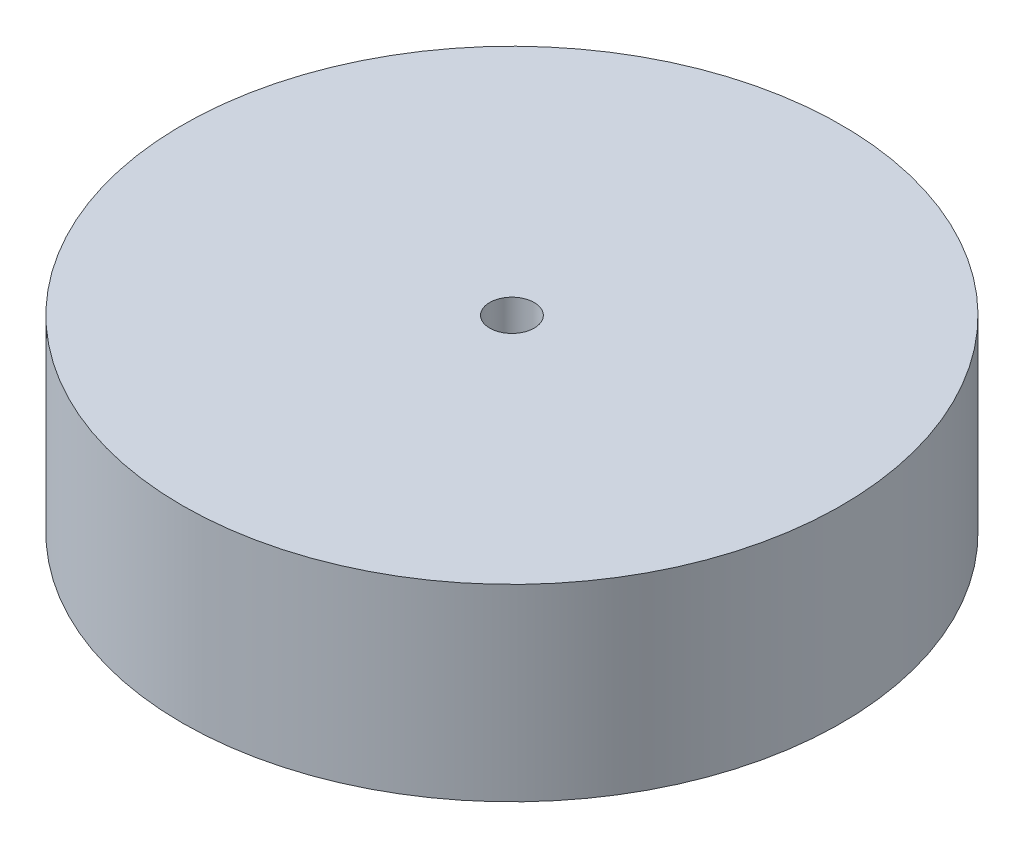
ISO-10303-21;
HEADER;
FILE_DESCRIPTION(('STEP AP214'),'2;1');
FILE_NAME('part.step','',(''),(''),'','','');
FILE_SCHEMA(('AUTOMOTIVE_DESIGN { 1 0 10303 214 1 1 1 1 }'));
ENDSEC;
DATA;
#1=APPLICATION_CONTEXT('core data for automotive mechanical design processes');
#2=APPLICATION_PROTOCOL_DEFINITION('international standard','automotive_design',2000,#1);
#3=PRODUCT_CONTEXT('',#1,'mechanical');
#4=PRODUCT('Part','Part','',(#3));
#5=PRODUCT_RELATED_PRODUCT_CATEGORY('part','',(#4));
#6=PRODUCT_DEFINITION_FORMATION('','',#4);
#7=PRODUCT_DEFINITION_CONTEXT('part definition',#1,'design');
#8=PRODUCT_DEFINITION('design','',#6,#7);
#9=PRODUCT_DEFINITION_SHAPE('','',#8);
#10=(LENGTH_UNIT() NAMED_UNIT(*) SI_UNIT(.MILLI.,.METRE.));
#11=(NAMED_UNIT(*) PLANE_ANGLE_UNIT() SI_UNIT($,.RADIAN.));
#12=(NAMED_UNIT(*) SI_UNIT($,.STERADIAN.) SOLID_ANGLE_UNIT());
#13=UNCERTAINTY_MEASURE_WITH_UNIT(LENGTH_MEASURE(1.E-05),#10,'distance_accuracy_value','');
#14=(GEOMETRIC_REPRESENTATION_CONTEXT(3) GLOBAL_UNCERTAINTY_ASSIGNED_CONTEXT((#13)) GLOBAL_UNIT_ASSIGNED_CONTEXT((#10,
#11,#12)) REPRESENTATION_CONTEXT('',''));
#15=CARTESIAN_POINT('',(0.,0.,0.));
#16=DIRECTION('',(0.,0.,1.));
#17=DIRECTION('',(1.,0.,0.));
#18=AXIS2_PLACEMENT_3D('',#15,#16,#17);
#19=CARTESIAN_POINT('',(0.,12.7,0.));
#20=DIRECTION('',(0.,1.,0.));
#21=DIRECTION('',(0.,0.,1.));
#22=AXIS2_PLACEMENT_3D('',#19,#20,#21);
#23=PLANE('',#22);
#24=CARTESIAN_POINT('',(0.,12.7,0.));
#25=DIRECTION('',(0.,1.,0.));
#26=DIRECTION('',(0.,0.,1.));
#27=AXIS2_PLACEMENT_3D('',#24,#25,#26);
#28=CIRCLE('',#27,22.225);
#29=CARTESIAN_POINT('',(0.,12.7,22.225));
#30=VERTEX_POINT('',#29);
#31=EDGE_CURVE('E10',#30,#30,#28,.T.);
#32=ORIENTED_EDGE('',*,*,#31,.T.);
#33=EDGE_LOOP('',(#32));
#34=FACE_BOUND('',#33,.T.);
#35=CARTESIAN_POINT('',(0.,12.7,0.));
#36=DIRECTION('',(0.,1.,0.));
#37=DIRECTION('',(0.,0.,1.));
#38=AXIS2_PLACEMENT_3D('',#35,#36,#37);
#39=CIRCLE('',#38,1.5);
#40=CARTESIAN_POINT('',(0.,12.7,1.5));
#41=VERTEX_POINT('',#40);
#42=EDGE_CURVE('E50',#41,#41,#39,.T.);
#43=ORIENTED_EDGE('',*,*,#42,.F.);
#44=EDGE_LOOP('',(#43));
#45=FACE_BOUND('',#44,.T.);
#46=ADVANCED_FACE('F37',(#34,#45),#23,.T.);
#47=CARTESIAN_POINT('',(0.,0.,0.));
#48=DIRECTION('',(0.,1.,0.));
#49=DIRECTION('',(0.,0.,1.));
#50=AXIS2_PLACEMENT_3D('',#47,#48,#49);
#51=PLANE('',#50);
#52=CARTESIAN_POINT('',(0.,0.,0.));
#53=DIRECTION('',(0.,1.,0.));
#54=DIRECTION('',(0.,0.,1.));
#55=AXIS2_PLACEMENT_3D('',#52,#53,#54);
#56=CIRCLE('',#55,22.225);
#57=CARTESIAN_POINT('',(0.,0.,22.225));
#58=VERTEX_POINT('',#57);
#59=EDGE_CURVE('E41',#58,#58,#56,.T.);
#60=ORIENTED_EDGE('',*,*,#59,.F.);
#61=EDGE_LOOP('',(#60));
#62=FACE_BOUND('',#61,.T.);
#63=CARTESIAN_POINT('',(0.,0.,0.));
#64=DIRECTION('',(0.,1.,0.));
#65=DIRECTION('',(0.,0.,1.));
#66=AXIS2_PLACEMENT_3D('',#63,#64,#65);
#67=CIRCLE('',#66,1.5);
#68=CARTESIAN_POINT('',(0.,0.,1.5));
#69=VERTEX_POINT('',#68);
#70=EDGE_CURVE('E52',#69,#69,#67,.T.);
#71=ORIENTED_EDGE('',*,*,#70,.T.);
#72=EDGE_LOOP('',(#71));
#73=FACE_BOUND('',#72,.T.);
#74=ADVANCED_FACE('F64',(#62,#73),#51,.F.);
#75=CARTESIAN_POINT('',(0.,12.7,0.));
#76=DIRECTION('',(0.,-1.,0.));
#77=DIRECTION('',(0.,0.,-1.));
#78=AXIS2_PLACEMENT_3D('',#75,#76,#77);
#79=CYLINDRICAL_SURFACE('',#78,22.225);
#80=ORIENTED_EDGE('',*,*,#31,.F.);
#81=EDGE_LOOP('',(#80));
#82=FACE_BOUND('',#81,.T.);
#83=ORIENTED_EDGE('',*,*,#59,.T.);
#84=EDGE_LOOP('',(#83));
#85=FACE_BOUND('',#84,.T.);
#86=ADVANCED_FACE('F39',(#82,#85),#79,.T.);
#87=CARTESIAN_POINT('',(0.,12.7,0.));
#88=DIRECTION('',(0.,-1.,0.));
#89=DIRECTION('',(0.,0.,-1.));
#90=AXIS2_PLACEMENT_3D('',#87,#88,#89);
#91=CYLINDRICAL_SURFACE('',#90,1.5);
#92=ORIENTED_EDGE('',*,*,#42,.T.);
#93=EDGE_LOOP('',(#92));
#94=FACE_BOUND('',#93,.T.);
#95=ORIENTED_EDGE('',*,*,#70,.F.);
#96=EDGE_LOOP('',(#95));
#97=FACE_BOUND('',#96,.T.);
#98=ADVANCED_FACE('F60',(#94,#97),#91,.F.);
#99=CLOSED_SHELL('',(#46,#74,#86,#98));
#100=MANIFOLD_SOLID_BREP('B2',#99);
#101=ADVANCED_BREP_SHAPE_REPRESENTATION('',(#18,#100),#14);
#102=SHAPE_DEFINITION_REPRESENTATION(#9,#101);
ENDSEC;
END-ISO-10303-21;
